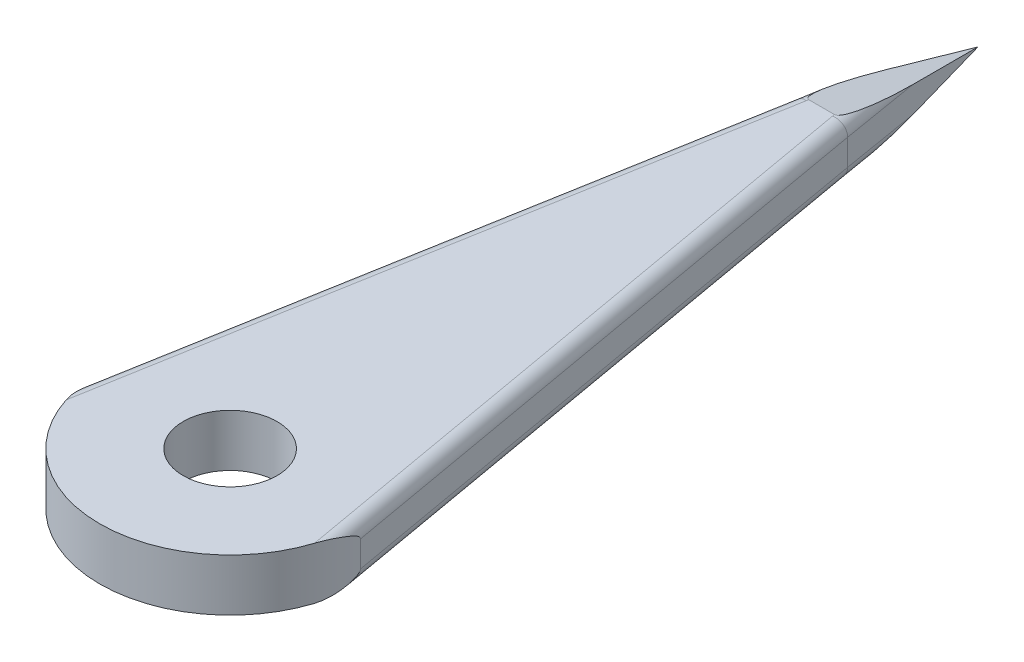
ISO-10303-21;
HEADER;
FILE_DESCRIPTION(('STEP AP214'),'2;1');
FILE_NAME('part.step','',(''),(''),'','','');
FILE_SCHEMA(('AUTOMOTIVE_DESIGN { 1 0 10303 214 1 1 1 1 }'));
ENDSEC;
DATA;
#1=APPLICATION_CONTEXT('core data for automotive mechanical design processes');
#2=APPLICATION_PROTOCOL_DEFINITION('international standard','automotive_design',2000,#1);
#3=PRODUCT_CONTEXT('',#1,'mechanical');
#4=PRODUCT('Part','Part','',(#3));
#5=PRODUCT_RELATED_PRODUCT_CATEGORY('part','',(#4));
#6=PRODUCT_DEFINITION_FORMATION('','',#4);
#7=PRODUCT_DEFINITION_CONTEXT('part definition',#1,'design');
#8=PRODUCT_DEFINITION('design','',#6,#7);
#9=PRODUCT_DEFINITION_SHAPE('','',#8);
#10=(LENGTH_UNIT() NAMED_UNIT(*) SI_UNIT(.MILLI.,.METRE.));
#11=(NAMED_UNIT(*) PLANE_ANGLE_UNIT() SI_UNIT($,.RADIAN.));
#12=(NAMED_UNIT(*) SI_UNIT($,.STERADIAN.) SOLID_ANGLE_UNIT());
#13=UNCERTAINTY_MEASURE_WITH_UNIT(LENGTH_MEASURE(1.E-05),#10,'distance_accuracy_value','');
#14=(GEOMETRIC_REPRESENTATION_CONTEXT(3) GLOBAL_UNCERTAINTY_ASSIGNED_CONTEXT((#13)) GLOBAL_UNIT_ASSIGNED_CONTEXT((#10,
#11,#12)) REPRESENTATION_CONTEXT('',''));
#15=CARTESIAN_POINT('',(0.,0.,0.));
#16=DIRECTION('',(0.,0.,1.));
#17=DIRECTION('',(1.,0.,0.));
#18=AXIS2_PLACEMENT_3D('',#15,#16,#17);
#19=CARTESIAN_POINT('',(0.,10.,0.));
#20=DIRECTION('',(0.,1.,0.));
#21=DIRECTION('',(0.,0.,1.));
#22=AXIS2_PLACEMENT_3D('',#19,#20,#21);
#23=PLANE('',#22);
#24=DIRECTION('',(-0.173648177666935,0.,-0.984807753012207));
#25=VECTOR('',#24,1.);
#26=CARTESIAN_POINT('',(2.53798061746943,10.,-112.991515948184));
#27=LINE('',#26,#25);
#28=CARTESIAN_POINT('',(23.8069497813539,10.,7.63080219296056));
#29=VERTEX_POINT('',#28);
#30=CARTESIAN_POINT('',(2.53798061746937,9.99999999757651,-112.991515948184));
#31=VERTEX_POINT('',#30);
#32=EDGE_CURVE('E460',#29,#31,#27,.T.);
#33=ORIENTED_EDGE('',*,*,#32,.T.);
#34=DIRECTION('',(-0.164398987305357,0.,-0.986393923832144));
#35=VECTOR('',#34,1.);
#36=CARTESIAN_POINT('',(2.5340151904196,10.,-113.014638924088));
#37=LINE('',#36,#35);
#38=CARTESIAN_POINT('',(2.46551561237576,10.,-113.425636392351));
#39=VERTEX_POINT('',#38);
#40=EDGE_CURVE('E302',#31,#39,#37,.T.);
#41=ORIENTED_EDGE('',*,*,#40,.T.);
#42=DIRECTION('',(1.,0.,0.));
#43=VECTOR('',#42,1.);
#44=CARTESIAN_POINT('',(0.,10.,-113.425636392351));
#45=LINE('',#44,#43);
#46=CARTESIAN_POINT('',(-2.46551561237576,10.,-113.425636392351));
#47=VERTEX_POINT('',#46);
#48=EDGE_CURVE('E202',#39,#47,#45,.F.);
#49=ORIENTED_EDGE('',*,*,#48,.T.);
#50=DIRECTION('',(-0.164398987305357,0.,0.986393923832144));
#51=VECTOR('',#50,1.);
#52=CARTESIAN_POINT('',(-21.4679021729631,10.,0.588682971172818));
#53=LINE('',#52,#51);
#54=CARTESIAN_POINT('',(-2.53798061746947,10.,-112.991515948184));
#55=VERTEX_POINT('',#54);
#56=EDGE_CURVE('E459',#47,#55,#53,.T.);
#57=ORIENTED_EDGE('',*,*,#56,.T.);
#58=DIRECTION('',(-0.173648177666935,0.,0.984807753012207));
#59=VECTOR('',#58,1.);
#60=CARTESIAN_POINT('',(-22.5379806174695,10.,0.434120444167337));
#61=LINE('',#60,#59);
#62=CARTESIAN_POINT('',(-23.8069497813539,10.,7.63080219296056));
#63=VERTEX_POINT('',#62);
#64=EDGE_CURVE('E456',#55,#63,#61,.T.);
#65=ORIENTED_EDGE('',*,*,#64,.T.);
#66=CARTESIAN_POINT('',(0.,10.,0.));
#67=DIRECTION('',(0.,1.,0.));
#68=DIRECTION('',(0.,0.,1.));
#69=AXIS2_PLACEMENT_3D('',#66,#67,#68);
#70=CIRCLE('',#69,25.);
#71=EDGE_CURVE('E198',#63,#29,#70,.T.);
#72=ORIENTED_EDGE('',*,*,#71,.T.);
#73=EDGE_LOOP('',(#33,#41,#49,#57,#65,#72));
#74=FACE_BOUND('',#73,.T.);
#75=CARTESIAN_POINT('',(0.,10.,0.));
#76=DIRECTION('',(0.,1.,0.));
#77=DIRECTION('',(0.,0.,1.));
#78=AXIS2_PLACEMENT_3D('',#75,#76,#77);
#79=CIRCLE('',#78,9.);
#80=CARTESIAN_POINT('',(0.,10.,9.));
#81=VERTEX_POINT('',#80);
#82=EDGE_CURVE('E190',#81,#81,#79,.T.);
#83=ORIENTED_EDGE('',*,*,#82,.F.);
#84=EDGE_LOOP('',(#83));
#85=FACE_BOUND('',#84,.T.);
#86=ADVANCED_FACE('F47',(#74,#85),#23,.T.);
#87=CARTESIAN_POINT('',(0.,0.,0.));
#88=DIRECTION('',(0.,1.,0.));
#89=DIRECTION('',(0.,0.,1.));
#90=AXIS2_PLACEMENT_3D('',#87,#88,#89);
#91=PLANE('',#90);
#92=DIRECTION('',(-0.173648177666935,0.,0.984807753012207));
#93=VECTOR('',#92,1.);
#94=CARTESIAN_POINT('',(-21.7841383772933,0.,-3.84113134740363));
#95=LINE('',#94,#93);
#96=CARTESIAN_POINT('',(-23.8069497813539,0.,7.63080219296055));
#97=VERTEX_POINT('',#96);
#98=CARTESIAN_POINT('',(-2.5378720358919,0.,-112.991497851254));
#99=VERTEX_POINT('',#98);
#100=EDGE_CURVE('E429',#97,#99,#95,.F.);
#101=ORIENTED_EDGE('',*,*,#100,.T.);
#102=DIRECTION('',(-0.164398987305357,0.,0.986393923832144));
#103=VECTOR('',#102,1.);
#104=CARTESIAN_POINT('',(-20.7922264972874,0.,-3.46537108288123));
#105=LINE('',#104,#103);
#106=CARTESIAN_POINT('',(-2.46551561237575,0.,-113.425636392351));
#107=VERTEX_POINT('',#106);
#108=EDGE_CURVE('E228',#99,#107,#105,.F.);
#109=ORIENTED_EDGE('',*,*,#108,.T.);
#110=DIRECTION('',(1.,0.,0.));
#111=VECTOR('',#110,1.);
#112=CARTESIAN_POINT('',(0.,0.,-113.425636392351));
#113=LINE('',#112,#111);
#114=CARTESIAN_POINT('',(2.46551561237575,0.,-113.425636392351));
#115=VERTEX_POINT('',#114);
#116=EDGE_CURVE('E203',#115,#107,#113,.F.);
#117=ORIENTED_EDGE('',*,*,#116,.F.);
#118=DIRECTION('',(-0.164398987305357,0.,-0.986393923832144));
#119=VECTOR('',#118,1.);
#120=CARTESIAN_POINT('',(20.7922264972874,0.,-3.46537108288123));
#121=LINE('',#120,#119);
#122=CARTESIAN_POINT('',(2.53798061746947,0.,-112.991515948184));
#123=VERTEX_POINT('',#122);
#124=EDGE_CURVE('E238',#115,#123,#121,.F.);
#125=ORIENTED_EDGE('',*,*,#124,.T.);
#126=DIRECTION('',(-0.173648177666935,0.,-0.984807753012207));
#127=VECTOR('',#126,1.);
#128=CARTESIAN_POINT('',(21.7841383772933,0.,-3.84113134740363));
#129=LINE('',#128,#127);
#130=CARTESIAN_POINT('',(23.8069497813539,0.,7.63080219296056));
#131=VERTEX_POINT('',#130);
#132=EDGE_CURVE('E434',#123,#131,#129,.F.);
#133=ORIENTED_EDGE('',*,*,#132,.T.);
#134=CARTESIAN_POINT('',(0.,0.,0.));
#135=DIRECTION('',(0.,1.,0.));
#136=DIRECTION('',(0.,0.,1.));
#137=AXIS2_PLACEMENT_3D('',#134,#135,#136);
#138=CIRCLE('',#137,25.);
#139=EDGE_CURVE('E194',#97,#131,#138,.T.);
#140=ORIENTED_EDGE('',*,*,#139,.F.);
#141=EDGE_LOOP('',(#101,#109,#117,#125,#133,#140));
#142=FACE_BOUND('',#141,.T.);
#143=CARTESIAN_POINT('',(0.,0.,0.));
#144=DIRECTION('',(0.,1.,0.));
#145=DIRECTION('',(0.,0.,1.));
#146=AXIS2_PLACEMENT_3D('',#143,#144,#145);
#147=CIRCLE('',#146,9.);
#148=CARTESIAN_POINT('',(0.,0.,9.));
#149=VERTEX_POINT('',#148);
#150=EDGE_CURVE('E172',#149,#149,#147,.T.);
#151=ORIENTED_EDGE('',*,*,#150,.T.);
#152=EDGE_LOOP('',(#151));
#153=FACE_BOUND('',#152,.T.);
#154=ADVANCED_FACE('F253',(#142,#153),#91,.F.);
#155=CARTESIAN_POINT('',(0.,10.,0.));
#156=DIRECTION('',(0.,-1.,0.));
#157=DIRECTION('',(0.,0.,-1.));
#158=AXIS2_PLACEMENT_3D('',#155,#156,#157);
#159=CYLINDRICAL_SURFACE('',#158,25.);
#160=ORIENTED_EDGE('',*,*,#139,.T.);
#161=CARTESIAN_POINT('',(23.8069497813539,0.,7.63080219296056));
#162=CARTESIAN_POINT('',(23.86118761935,2.90606387358615E-05,7.46160122354186));
#163=CARTESIAN_POINT('',(23.9136025654729,0.0041117199697887,7.29185614935265));
#164=CARTESIAN_POINT('',(24.0147033579821,0.0196050284943524,6.95165083974532));
#165=CARTESIAN_POINT('',(24.0633905021354,0.0310131143712274,6.78119087520216));
#166=CARTESIAN_POINT('',(24.1569518410746,0.060367077155256,6.43995069059922));
#167=CARTESIAN_POINT('',(24.2018291445944,0.0783075593155266,6.26917085015548));
#168=CARTESIAN_POINT('',(24.2877985871158,0.120139261944268,5.92738614118013));
#169=CARTESIAN_POINT('',(24.3288903655796,0.144031048420816,5.75638125278463));
#170=CARTESIAN_POINT('',(24.4461785016797,0.223663054999159,5.24465816415624));
#171=CARTESIAN_POINT('',(24.516763633619,0.287486534843838,4.90385691142774));
#172=CARTESIAN_POINT('',(24.6114707478153,0.397476751257461,4.39379808511729));
#173=CARTESIAN_POINT('',(24.641179524322,0.436518865190008,4.22395844264783));
#174=CARTESIAN_POINT('',(24.6969192939034,0.519236844944027,3.88480256049016));
#175=CARTESIAN_POINT('',(24.7229505629489,0.562912362630417,3.71548628246088));
#176=CARTESIAN_POINT('',(24.762469627763,0.637967936728816,3.43973029217252));
#177=CARTESIAN_POINT('',(24.7770498113683,0.667962957246176,3.33306610430292));
#178=CARTESIAN_POINT('',(24.8047655190724,0.729835530265041,3.12011826759896));
#179=CARTESIAN_POINT('',(24.8179012886104,0.761712761516158,3.01383455709133));
#180=CARTESIAN_POINT('',(24.8551674645724,0.860269387511625,2.69559760328611));
#181=CARTESIAN_POINT('',(24.8771541243613,0.929868760356525,2.48427682908946));
#182=CARTESIAN_POINT('',(24.9095952203396,1.05521637156981,2.12916120628585));
#183=CARTESIAN_POINT('',(24.9215143088576,1.10860635040243,1.98466248858424));
#184=CARTESIAN_POINT('',(24.9427151717141,1.22054191307143,1.69754043181202));
#185=CARTESIAN_POINT('',(24.9519983717919,1.27908468725089,1.55491611885505));
#186=CARTESIAN_POINT('',(24.9654921026479,1.3835576744935,1.31668496581051));
#187=CARTESIAN_POINT('',(24.9703809250095,1.4277006301266,1.22033373578047));
#188=CARTESIAN_POINT('',(24.9789727042369,1.52008414276259,1.02957115890348));
#189=CARTESIAN_POINT('',(24.9826760884007,1.56832321534607,0.935159124572295));
#190=CARTESIAN_POINT('',(24.9887220757472,1.66688710010627,0.755818543935629));
#191=CARTESIAN_POINT('',(24.9911412420334,1.71683522187439,0.670686402500149));
#192=CARTESIAN_POINT('',(24.9950353038236,1.82364100615413,0.504964396201369));
#193=CARTESIAN_POINT('',(24.9965129408549,1.88047802912087,0.424361972526507));
#194=CARTESIAN_POINT('',(24.9980541491194,1.97112356995395,0.31384138276737));
#195=CARTESIAN_POINT('',(24.998448994304,2.00050368409039,0.280333954251902));
#196=CARTESIAN_POINT('',(24.9990876474112,2.06234555800604,0.215982190889163));
#197=CARTESIAN_POINT('',(24.9993308739096,2.09481863683183,0.185148493382142));
#198=CARTESIAN_POINT('',(24.9996928290153,2.16414102393775,0.127307784202722));
#199=CARTESIAN_POINT('',(24.9998091524253,2.20106062350301,0.100382816880712));
#200=CARTESIAN_POINT('',(24.9999517891199,2.27922062926169,0.0542322606929398));
#201=CARTESIAN_POINT('',(24.9999790526366,2.32041055010239,0.0349273351654357));
#202=CARTESIAN_POINT('',(24.9999967926612,2.38536636768328,0.0145711327951832));
#203=CARTESIAN_POINT('',(24.9999987516389,2.40777393507592,0.00921086771850095));
#204=CARTESIAN_POINT('',(25.0000000165703,2.45342776594458,0.00187833751833617));
#205=CARTESIAN_POINT('',(24.9999992876308,2.47668115248554,-4.88825280096766E-05));
#206=CARTESIAN_POINT('',(25.,2.5,0.));
#207=B_SPLINE_CURVE_WITH_KNOTS('',3,(#161,#162,#163,#164,#165,#166,#167,#168,#169,#170,#171,
#172,#173,#174,#175,#176,#177,#178,#179,#180,#181,#182,#183,#184,#185,#186,#187,#188,#189,#190,
#191,#192,#193,#194,#195,#196,#197,#198,#199,#200,#201,#202,#203,#204,#205,#206),.UNSPECIFIED.,
.F.,.F.,(4,2,2,2,2,2,2,2,2,2,2,2,2,2,2,2,2,2,2,2,2,2,4),(0.,0.532932584561311,1.0656787866544,
1.59798601715028,2.13034389289775,3.19077816986885,3.72106136759603,4.25130475018522,
4.58655080693914,4.92173980932253,5.59217515879383,6.05561064000949,6.5187949716447,
6.83701008464178,7.15511036571006,7.45114885966266,7.74632136699551,7.87989251723258,
8.01397278207746,8.15055235076595,8.28566982871892,8.35454206169484,8.42431149227619),.UNSPECIFIED.);
#208=CARTESIAN_POINT('',(25.,2.5,0.));
#209=VERTEX_POINT('',#208);
#210=EDGE_CURVE('E270',#131,#209,#207,.T.);
#211=ORIENTED_EDGE('',*,*,#210,.T.);
#212=DIRECTION('',(0.,-1.,0.));
#213=VECTOR('',#212,1.);
#214=CARTESIAN_POINT('',(25.,10.,0.));
#215=LINE('',#214,#213);
#216=CARTESIAN_POINT('',(25.,7.5,0.));
#217=VERTEX_POINT('',#216);
#218=EDGE_CURVE('E212',#217,#209,#215,.T.);
#219=ORIENTED_EDGE('',*,*,#218,.F.);
#220=CARTESIAN_POINT('',(25.,7.5,0.));
#221=CARTESIAN_POINT('',(24.9999987771249,7.52765441440673,-9.06174578465152E-05));
#222=CARTESIAN_POINT('',(25.0000000890554,7.55517691592617,0.00263921472474038));
#223=CARTESIAN_POINT('',(24.9999975065192,7.60890684732646,0.0128554869018683));
#224=CARTESIAN_POINT('',(24.999993691592,7.63512797230361,0.02026833490609));
#225=CARTESIAN_POINT('',(24.9999673495212,7.69472233194478,0.0421885292219197));
#226=CARTESIAN_POINT('',(24.9999389213576,7.72750941197358,0.0582485042108595));
#227=CARTESIAN_POINT('',(24.9998253773941,7.79036365037819,0.0952770838970087));
#228=CARTESIAN_POINT('',(24.9997398630015,7.82040998347208,0.116279525982227));
#229=CARTESIAN_POINT('',(24.9994651054734,7.88319263623485,0.165711940906818));
#230=CARTESIAN_POINT('',(24.9992596396701,7.91540298015664,0.194797384160698));
#231=CARTESIAN_POINT('',(24.9987088012826,7.97691835730882,0.255926250753424));
#232=CARTESIAN_POINT('',(24.9983631766786,8.00621803809137,0.287974921714242));
#233=CARTESIAN_POINT('',(24.9975129071079,8.06259528964041,0.35418910652391));
#234=CARTESIAN_POINT('',(24.9970075727322,8.08966257292908,0.388363271783156));
#235=CARTESIAN_POINT('',(24.995827127886,8.14187379428088,0.458087318281707));
#236=CARTESIAN_POINT('',(24.9951521611652,8.167019337452,0.493636013244458));
#237=CARTESIAN_POINT('',(24.9929951815829,8.23581437523319,0.595396783729696));
#238=CARTESIAN_POINT('',(24.9913057700226,8.27768903497139,0.662800991571494));
#239=CARTESIAN_POINT('',(24.9872991590424,8.35777524712459,0.799747938706746));
#240=CARTESIAN_POINT('',(24.9849815430536,8.39598434602378,0.869292069782145));
#241=CARTESIAN_POINT('',(24.9770423734924,8.50659265142415,1.08034693051584));
#242=CARTESIAN_POINT('',(24.970439877006,8.57480282548953,1.22400970500256));
#243=CARTESIAN_POINT('',(24.9544932762578,8.7040524726802,1.51479482594488));
#244=CARTESIAN_POINT('',(24.9451410823744,8.76507003232784,1.66192618519219));
#245=CARTESIAN_POINT('',(24.9236477054168,8.88140761305994,1.95800542765486));
#246=CARTESIAN_POINT('',(24.9115099678982,8.93673455167757,2.1069508532147));
#247=CARTESIAN_POINT('',(24.8812151722611,9.05516211653285,2.44120911739481));
#248=CARTESIAN_POINT('',(24.8623142550535,9.11705485518528,2.62688096845023));
#249=CARTESIAN_POINT('',(24.8200956323687,9.23473052200828,2.99967639661601));
#250=CARTESIAN_POINT('',(24.7967772213248,9.29051247190793,3.18680020104872));
#251=CARTESIAN_POINT('',(24.7456285437092,9.39638562266383,3.56227611096448));
#252=CARTESIAN_POINT('',(24.7177930631217,9.44647013199219,3.75062939155554));
#253=CARTESIAN_POINT('',(24.6575675079573,9.54092756678546,4.12806139290637));
#254=CARTESIAN_POINT('',(24.6251769440923,9.58529987768766,4.31714018947293));
#255=CARTESIAN_POINT('',(24.5559567955646,9.66795307488565,4.6948565314692));
#256=CARTESIAN_POINT('',(24.5191488190311,9.70626164564803,4.88349196579041));
#257=CARTESIAN_POINT('',(24.4409368683711,9.77668342633792,5.26096511590824));
#258=CARTESIAN_POINT('',(24.3995330403575,9.80879683313542,5.44980282508514));
#259=CARTESIAN_POINT('',(24.3121553297389,9.86628419477466,5.82722764321483));
#260=CARTESIAN_POINT('',(24.266186559184,9.89166557407114,6.0158147980898));
#261=CARTESIAN_POINT('',(24.1696503293297,9.93505687199533,6.39263816395693));
#262=CARTESIAN_POINT('',(24.1190836696086,9.9530680693214,6.58087443018089));
#263=CARTESIAN_POINT('',(24.0256858345058,9.97763846444689,6.91294769194234));
#264=CARTESIAN_POINT('',(23.9837927516587,9.98588724724387,7.05692356216245));
#265=CARTESIAN_POINT('',(23.8973503161437,9.99706131704681,7.3443311935967));
#266=CARTESIAN_POINT('',(23.8528001070952,9.99998487807651,7.48776276336991));
#267=CARTESIAN_POINT('',(23.8069497813539,10.,7.63080219296056));
#268=B_SPLINE_CURVE_WITH_KNOTS('',3,(#220,#221,#222,#223,#224,#225,#226,#227,#228,#229,#230,
#231,#232,#233,#234,#235,#236,#237,#238,#239,#240,#241,#242,#243,#244,#245,#246,#247,#248,#249,
#250,#251,#252,#253,#254,#255,#256,#257,#258,#259,#260,#261,#262,#263,#264,#265,#266,#267),
.UNSPECIFIED.,.F.,.F.,(4,2,2,2,2,2,2,2,2,2,2,2,2,2,2,2,2,2,2,2,2,2,2,4),(0.,0.0826172610099825,
0.163967459057733,0.272875164935347,0.382551362593083,0.512456202847069,0.64259566836646,
0.773304753025832,0.903903443644084,1.14182360545087,1.37990192219809,1.85701376520105,
2.33554356373936,2.81348460895396,3.40319653140517,3.99300272279461,4.58349462955167,
5.17405001301736,5.76182614803339,6.34958360161588,6.93669012257959,7.52369473957773,
7.97410371590789,8.4246586499082),.UNSPECIFIED.);
#269=EDGE_CURVE('E229',#217,#29,#268,.T.);
#270=ORIENTED_EDGE('',*,*,#269,.T.);
#271=ORIENTED_EDGE('',*,*,#71,.F.);
#272=CARTESIAN_POINT('',(-23.8069497813539,10.,7.63080219296056));
#273=CARTESIAN_POINT('',(-23.86118761935,9.99997093936126,7.46160122354186));
#274=CARTESIAN_POINT('',(-23.9136025654729,9.99588828003021,7.29185614935265));
#275=CARTESIAN_POINT('',(-24.0147033579821,9.98039497150565,6.95165083974532));
#276=CARTESIAN_POINT('',(-24.0633905021354,9.96898688562877,6.78119087520216));
#277=CARTESIAN_POINT('',(-24.1569518410746,9.93963292284475,6.43995069059922));
#278=CARTESIAN_POINT('',(-24.2018291445944,9.92169244068447,6.26917085015548));
#279=CARTESIAN_POINT('',(-24.2877985871158,9.87986073805573,5.92738614118014));
#280=CARTESIAN_POINT('',(-24.3288903655796,9.85596895157918,5.75638125278464));
#281=CARTESIAN_POINT('',(-24.4461785016797,9.77633694500084,5.24465816415625));
#282=CARTESIAN_POINT('',(-24.516763633619,9.71251346515616,4.90385691142775));
#283=CARTESIAN_POINT('',(-24.6114707478153,9.60252324874254,4.3937980851173));
#284=CARTESIAN_POINT('',(-24.641179524322,9.56348113480999,4.22395844264783));
#285=CARTESIAN_POINT('',(-24.6969192939034,9.48076315505597,3.88480256049017));
#286=CARTESIAN_POINT('',(-24.7229505629489,9.43708763736959,3.71548628246088));
#287=CARTESIAN_POINT('',(-24.762469627763,9.36203206327119,3.43973029217253));
#288=CARTESIAN_POINT('',(-24.7770498113683,9.33203704275383,3.33306610430292));
#289=CARTESIAN_POINT('',(-24.8047655190724,9.27016446973496,3.12011826759896));
#290=CARTESIAN_POINT('',(-24.8179012886104,9.23828723848384,3.01383455709134));
#291=CARTESIAN_POINT('',(-24.8551674645724,9.13973061248838,2.69559760328611));
#292=CARTESIAN_POINT('',(-24.8771541243613,9.07013123964347,2.48427682908946));
#293=CARTESIAN_POINT('',(-24.9095952203396,8.94478362843019,2.12916120628585));
#294=CARTESIAN_POINT('',(-24.9215143088576,8.89139364959757,1.98466248858424));
#295=CARTESIAN_POINT('',(-24.9427151717141,8.77945808692857,1.69754043181201));
#296=CARTESIAN_POINT('',(-24.9519983717919,8.7209153127491,1.55491611885504));
#297=CARTESIAN_POINT('',(-24.9654921026479,8.6164423255065,1.31668496581049));
#298=CARTESIAN_POINT('',(-24.9703809250095,8.57229936987339,1.22033373578045));
#299=CARTESIAN_POINT('',(-24.9789727042369,8.4799158572374,1.02957115890346));
#300=CARTESIAN_POINT('',(-24.9826760884007,8.43167678465393,0.935159124572272));
#301=CARTESIAN_POINT('',(-24.9887220757472,8.33311289989373,0.755818543935604));
#302=CARTESIAN_POINT('',(-24.9911412420334,8.2831647781256,0.670686402500124));
#303=CARTESIAN_POINT('',(-24.9950353038236,8.17635899384586,0.504964396201343));
#304=CARTESIAN_POINT('',(-24.9965129408549,8.11952197087912,0.424361972526478));
#305=CARTESIAN_POINT('',(-24.9980541491194,8.02887643004603,0.313841382767342));
#306=CARTESIAN_POINT('',(-24.998448994304,7.99949631590959,0.280333954251876));
#307=CARTESIAN_POINT('',(-24.9990876474112,7.93765444199394,0.215982190889141));
#308=CARTESIAN_POINT('',(-24.9993308739096,7.90518136316815,0.185148493382121));
#309=CARTESIAN_POINT('',(-24.9996928290153,7.83585897606223,0.127307784202704));
#310=CARTESIAN_POINT('',(-24.9998091524253,7.79893937649697,0.100382816880697));
#311=CARTESIAN_POINT('',(-24.9999517891199,7.72077937073829,0.0542322606929274));
#312=CARTESIAN_POINT('',(-24.9999790526366,7.67958944989759,0.0349273351654223));
#313=CARTESIAN_POINT('',(-24.9999967926612,7.61463363231671,0.0145711327951736));
#314=CARTESIAN_POINT('',(-24.9999987516389,7.59222606492408,0.0092108677184937));
#315=CARTESIAN_POINT('',(-25.0000000165703,7.54657223405542,0.00187833751833142));
#316=CARTESIAN_POINT('',(-24.9999992876308,7.52331884751446,-4.88825280141811E-05));
#317=CARTESIAN_POINT('',(-25.,7.5,0.));
#318=B_SPLINE_CURVE_WITH_KNOTS('',3,(#272,#273,#274,#275,#276,#277,#278,#279,#280,#281,#282,
#283,#284,#285,#286,#287,#288,#289,#290,#291,#292,#293,#294,#295,#296,#297,#298,#299,#300,#301,
#302,#303,#304,#305,#306,#307,#308,#309,#310,#311,#312,#313,#314,#315,#316,#317),.UNSPECIFIED.,
.F.,.F.,(4,2,2,2,2,2,2,2,2,2,2,2,2,2,2,2,2,2,2,2,2,2,4),(0.,0.532932584561308,1.0656787866544,
1.59798601715028,2.13034389289775,3.19077816986884,3.72106136759602,4.25130475018521,
4.58655080693914,4.92173980932252,5.59217515879383,6.0556106400095,6.51879497164472,
6.8370100846418,7.15511036571008,7.45114885966269,7.74632136699555,7.87989251723262,
8.01397278207749,8.15055235076597,8.28566982871894,8.35454206169485,8.42431149227619),.UNSPECIFIED.);
#319=CARTESIAN_POINT('',(-25.,7.5,0.));
#320=VERTEX_POINT('',#319);
#321=EDGE_CURVE('E237',#63,#320,#318,.T.);
#322=ORIENTED_EDGE('',*,*,#321,.T.);
#323=DIRECTION('',(0.,-1.,0.));
#324=VECTOR('',#323,1.);
#325=CARTESIAN_POINT('',(-25.,10.,0.));
#326=LINE('',#325,#324);
#327=CARTESIAN_POINT('',(-25.,2.5,0.));
#328=VERTEX_POINT('',#327);
#329=EDGE_CURVE('E207',#320,#328,#326,.T.);
#330=ORIENTED_EDGE('',*,*,#329,.T.);
#331=CARTESIAN_POINT('',(-25.,2.5,0.));
#332=CARTESIAN_POINT('',(-24.9999987771248,2.47234558559326,-9.06174578688166E-05));
#333=CARTESIAN_POINT('',(-25.0000000890554,2.44482308407383,0.00263921472471636));
#334=CARTESIAN_POINT('',(-24.9999975065192,2.39109315267353,0.0128554869018551));
#335=CARTESIAN_POINT('',(-24.999993691592,2.36487202769639,0.0202683349060892));
#336=CARTESIAN_POINT('',(-24.9999673495212,2.30527766805522,0.0421885292219352));
#337=CARTESIAN_POINT('',(-24.9999389213576,2.27249058802641,0.0582485042108748));
#338=CARTESIAN_POINT('',(-24.9998253773941,2.2096363496218,0.0952770838970245));
#339=CARTESIAN_POINT('',(-24.9997398630015,2.17959001652791,0.116279525982243));
#340=CARTESIAN_POINT('',(-24.9994651054734,2.11680736376515,0.165711940906836));
#341=CARTESIAN_POINT('',(-24.9992596396701,2.08459701984336,0.194797384160718));
#342=CARTESIAN_POINT('',(-24.9987088012826,2.02308164269118,0.255926250753443));
#343=CARTESIAN_POINT('',(-24.9983631766786,1.99378196190863,0.287974921714259));
#344=CARTESIAN_POINT('',(-24.9975129071079,1.93740471035958,0.354189106523926));
#345=CARTESIAN_POINT('',(-24.9970075727322,1.91033742707092,0.388363271783174));
#346=CARTESIAN_POINT('',(-24.995827127886,1.85812620571912,0.458087318281727));
#347=CARTESIAN_POINT('',(-24.9951521611652,1.83298066254801,0.493636013244477));
#348=CARTESIAN_POINT('',(-24.9929951815829,1.76418562476681,0.595396783729712));
#349=CARTESIAN_POINT('',(-24.9913057700226,1.72231096502861,0.662800991571508));
#350=CARTESIAN_POINT('',(-24.9872991590424,1.64222475287541,0.799747938706756));
#351=CARTESIAN_POINT('',(-24.9849815430536,1.60401565397622,0.869292069782154));
#352=CARTESIAN_POINT('',(-24.9770423734924,1.49340734857585,1.08034693051585));
#353=CARTESIAN_POINT('',(-24.970439877006,1.42519717451048,1.22400970500256));
#354=CARTESIAN_POINT('',(-24.9544932762578,1.29594752731981,1.51479482594487));
#355=CARTESIAN_POINT('',(-24.9451410823744,1.23492996767217,1.66192618519218));
#356=CARTESIAN_POINT('',(-24.9236477054168,1.11859238694007,1.95800542765484));
#357=CARTESIAN_POINT('',(-24.9115099678982,1.06326544832244,2.10695085321468));
#358=CARTESIAN_POINT('',(-24.8812151722611,0.944837883467157,2.44120911739478));
#359=CARTESIAN_POINT('',(-24.8623142550535,0.882945144814738,2.6268809684502));
#360=CARTESIAN_POINT('',(-24.8200956323687,0.765269477991733,2.99967639661597));
#361=CARTESIAN_POINT('',(-24.7967772213248,0.709487528092086,3.18680020104868));
#362=CARTESIAN_POINT('',(-24.7456285437092,0.603614377336182,3.56227611096444));
#363=CARTESIAN_POINT('',(-24.7177930631217,0.553529868007822,3.75062939155549));
#364=CARTESIAN_POINT('',(-24.6575675079574,0.459072433214556,4.12806139290631));
#365=CARTESIAN_POINT('',(-24.6251769440923,0.414700122312352,4.31714018947287));
#366=CARTESIAN_POINT('',(-24.5559567955647,0.332046925114364,4.69485653146914));
#367=CARTESIAN_POINT('',(-24.5191488190311,0.293738354351986,4.88349196579034));
#368=CARTESIAN_POINT('',(-24.4409368683711,0.223316573662089,5.26096511590816));
#369=CARTESIAN_POINT('',(-24.3995330403575,0.191203166864591,5.44980282508506));
#370=CARTESIAN_POINT('',(-24.3121553297389,0.133715805225355,5.82722764321475));
#371=CARTESIAN_POINT('',(-24.266186559184,0.108334425928872,6.01581479808971));
#372=CARTESIAN_POINT('',(-24.1696503293297,0.0649431280046767,6.39263816395683));
#373=CARTESIAN_POINT('',(-24.1190836696086,0.0469319306786094,6.58087443018079));
#374=CARTESIAN_POINT('',(-24.0256858345058,0.0223615355531106,6.91294769194226));
#375=CARTESIAN_POINT('',(-23.9837927516587,0.0141127527561304,7.05692356216238));
#376=CARTESIAN_POINT('',(-23.8973503161437,0.00293868295319113,7.34433119359667));
#377=CARTESIAN_POINT('',(-23.8528001070952,1.51219234849637E-05,7.48776276336989));
#378=CARTESIAN_POINT('',(-23.8069497813539,0.,7.63080219296055));
#379=B_SPLINE_CURVE_WITH_KNOTS('',3,(#331,#332,#333,#334,#335,#336,#337,#338,#339,#340,#341,
#342,#343,#344,#345,#346,#347,#348,#349,#350,#351,#352,#353,#354,#355,#356,#357,#358,#359,#360,
#361,#362,#363,#364,#365,#366,#367,#368,#369,#370,#371,#372,#373,#374,#375,#376,#377,#378),
.UNSPECIFIED.,.F.,.F.,(4,2,2,2,2,2,2,2,2,2,2,2,2,2,2,2,2,2,2,2,2,2,2,4),(0.,0.0826172610099868,
0.163967459057742,0.27287516493536,0.382551362593098,0.512456202847085,0.642595668366473,
0.773304753025844,0.903903443644095,1.14182360545088,1.37990192219809,1.85701376520104,
2.33554356373934,2.81348460895393,3.40319653140513,3.99300272279455,4.58349462955161,
5.17405001301729,5.76182614803331,6.34958360161579,6.93669012257949,7.52369473957762,
7.97410371590783,8.4246586499082),.UNSPECIFIED.);
#380=EDGE_CURVE('E263',#328,#97,#379,.T.);
#381=ORIENTED_EDGE('',*,*,#380,.T.);
#382=EDGE_LOOP('',(#160,#211,#219,#270,#271,#322,#330,#381));
#383=FACE_BOUND('',#382,.T.);
#384=ADVANCED_FACE('F247',(#383),#159,.T.);
#385=CARTESIAN_POINT('',(25.,10.,0.));
#386=DIRECTION('',(-0.984807753012207,0.,0.173648177666935));
#387=DIRECTION('',(0.173648177666935,0.,0.984807753012207));
#388=AXIS2_PLACEMENT_3D('',#385,#386,#387);
#389=PLANE('',#388);
#390=ORIENTED_EDGE('',*,*,#218,.T.);
#391=DIRECTION('',(-0.173648177666935,0.,-0.984807753012207));
#392=VECTOR('',#391,1.);
#393=CARTESIAN_POINT('',(25.,2.5,0.));
#394=LINE('',#393,#392);
#395=CARTESIAN_POINT('',(5.,2.5,-113.425636392351));
#396=VERTEX_POINT('',#395);
#397=EDGE_CURVE('E398',#209,#396,#394,.T.);
#398=ORIENTED_EDGE('',*,*,#397,.T.);
#399=DIRECTION('',(0.,1.,0.));
#400=VECTOR('',#399,1.);
#401=CARTESIAN_POINT('',(5.,0.,-113.425636392351));
#402=LINE('',#401,#400);
#403=CARTESIAN_POINT('',(5.,7.5,-113.425636392351));
#404=VERTEX_POINT('',#403);
#405=EDGE_CURVE('E217',#404,#396,#402,.F.);
#406=ORIENTED_EDGE('',*,*,#405,.F.);
#407=DIRECTION('',(-0.173648177666935,0.,-0.984807753012207));
#408=VECTOR('',#407,1.);
#409=CARTESIAN_POINT('',(25.,7.5,0.));
#410=LINE('',#409,#408);
#411=EDGE_CURVE('E216',#404,#217,#410,.F.);
#412=ORIENTED_EDGE('',*,*,#411,.T.);
#413=EDGE_LOOP('',(#390,#398,#406,#412));
#414=FACE_BOUND('',#413,.T.);
#415=ADVANCED_FACE('F252',(#414),#389,.F.);
#416=CARTESIAN_POINT('',(-5.,10.,-113.425636392351));
#417=DIRECTION('',(0.984807753012207,0.,0.173648177666935));
#418=DIRECTION('',(0.173648177666935,0.,-0.984807753012207));
#419=AXIS2_PLACEMENT_3D('',#416,#417,#418);
#420=PLANE('',#419);
#421=DIRECTION('',(0.,1.,0.));
#422=VECTOR('',#421,1.);
#423=CARTESIAN_POINT('',(-5.,10.,-113.425636392351));
#424=LINE('',#423,#422);
#425=CARTESIAN_POINT('',(-5.,7.5,-113.425636392351));
#426=VERTEX_POINT('',#425);
#427=CARTESIAN_POINT('',(-5.,2.5,-113.425636392351));
#428=VERTEX_POINT('',#427);
#429=EDGE_CURVE('E211',#426,#428,#424,.F.);
#430=ORIENTED_EDGE('',*,*,#429,.T.);
#431=DIRECTION('',(-0.173648177666935,0.,0.984807753012207));
#432=VECTOR('',#431,1.);
#433=CARTESIAN_POINT('',(-5.,2.5,-113.425636392351));
#434=LINE('',#433,#432);
#435=EDGE_CURVE('E294',#428,#328,#434,.T.);
#436=ORIENTED_EDGE('',*,*,#435,.T.);
#437=ORIENTED_EDGE('',*,*,#329,.F.);
#438=DIRECTION('',(-0.173648177666935,0.,0.984807753012207));
#439=VECTOR('',#438,1.);
#440=CARTESIAN_POINT('',(-5.,7.5,-113.425636392351));
#441=LINE('',#440,#439);
#442=EDGE_CURVE('E303',#320,#426,#441,.F.);
#443=ORIENTED_EDGE('',*,*,#442,.T.);
#444=EDGE_LOOP('',(#430,#436,#437,#443));
#445=FACE_BOUND('',#444,.T.);
#446=ADVANCED_FACE('F359',(#445),#420,.F.);
#447=CARTESIAN_POINT('',(0.,10.,0.));
#448=DIRECTION('',(0.,-1.,0.));
#449=DIRECTION('',(0.,0.,-1.));
#450=AXIS2_PLACEMENT_3D('',#447,#448,#449);
#451=CYLINDRICAL_SURFACE('',#450,9.);
#452=ORIENTED_EDGE('',*,*,#82,.T.);
#453=EDGE_LOOP('',(#452));
#454=FACE_BOUND('',#453,.T.);
#455=ORIENTED_EDGE('',*,*,#150,.F.);
#456=EDGE_LOOP('',(#455));
#457=FACE_BOUND('',#456,.T.);
#458=ADVANCED_FACE('F357',(#454,#457),#451,.F.);
#459=CARTESIAN_POINT('',(0.,28.1230761717326,-4.68717936195544));
#460=DIRECTION('',(0.,-0.986393923832144,0.164398987305357));
#461=DIRECTION('',(0.,-0.164398987305357,-0.986393923832144));
#462=AXIS2_PLACEMENT_3D('',#459,#460,#461);
#463=PLANE('',#462);
#464=DIRECTION('',(0.162221421130762,-0.162221421130762,-0.973328526784575));
#465=VECTOR('',#464,1.);
#466=CARTESIAN_POINT('',(-5.,10.,-113.425636392351));
#467=LINE('',#466,#465);
#468=CARTESIAN_POINT('',(-2.5,7.5,-128.425636392351));
#469=VERTEX_POINT('',#468);
#470=CARTESIAN_POINT('',(0.,5.,-143.425636392351));
#471=VERTEX_POINT('',#470);
#472=EDGE_CURVE('E148',#469,#471,#467,.T.);
#473=ORIENTED_EDGE('',*,*,#472,.F.);
#474=CARTESIAN_POINT('',(0.0344843876242569,7.5,-128.425636392351));
#475=DIRECTION('',(0.,-0.986393923832144,0.164398987305357));
#476=DIRECTION('',(0.166604139308748,-0.162101324732836,-0.972607948397015));
#477=AXIS2_PLACEMENT_3D('',#474,#475,#476);
#478=ELLIPSE('',#477,15.4166666666667,2.5);
#479=EDGE_CURVE('E12',#469,#47,#478,.F.);
#480=ORIENTED_EDGE('',*,*,#479,.T.);
#481=ORIENTED_EDGE('',*,*,#48,.F.);
#482=CARTESIAN_POINT('',(-0.0344843876242569,7.5,-128.425636392351));
#483=DIRECTION('',(0.,-0.986393923832144,0.164398987305357));
#484=DIRECTION('',(0.166604139308748,0.162101324732836,0.972607948397015));
#485=AXIS2_PLACEMENT_3D('',#482,#483,#484);
#486=ELLIPSE('',#485,15.4166666666667,2.5);
#487=CARTESIAN_POINT('',(2.5,7.5,-128.425636392351));
#488=VERTEX_POINT('',#487);
#489=EDGE_CURVE('E58',#39,#488,#486,.F.);
#490=ORIENTED_EDGE('',*,*,#489,.T.);
#491=DIRECTION('',(-0.162221421130762,-0.162221421130762,-0.973328526784575));
#492=VECTOR('',#491,1.);
#493=CARTESIAN_POINT('',(5.,10.,-113.425636392351));
#494=LINE('',#493,#492);
#495=EDGE_CURVE('E161',#488,#471,#494,.T.);
#496=ORIENTED_EDGE('',*,*,#495,.T.);
#497=EDGE_LOOP('',(#473,#480,#481,#490,#496));
#498=FACE_BOUND('',#497,.T.);
#499=ADVANCED_FACE('F175',(#498),#463,.F.);
#500=CARTESIAN_POINT('',(-23.2582113068678,0.,-3.87636855114463));
#501=DIRECTION('',(0.986393923832144,0.,0.164398987305357));
#502=DIRECTION('',(0.164398987305357,0.,-0.986393923832144));
#503=AXIS2_PLACEMENT_3D('',#500,#501,#502);
#504=PLANE('',#503);
#505=DIRECTION('',(0.162221421130762,0.162221421130762,-0.973328526784575));
#506=VECTOR('',#505,1.);
#507=CARTESIAN_POINT('',(-5.,0.,-113.425636392351));
#508=LINE('',#507,#506);
#509=CARTESIAN_POINT('',(-2.5,2.5,-128.425636392351));
#510=VERTEX_POINT('',#509);
#511=EDGE_CURVE('E152',#510,#471,#508,.T.);
#512=ORIENTED_EDGE('',*,*,#511,.F.);
#513=DIRECTION('',(-0.164398987305357,0.,0.986393923832144));
#514=VECTOR('',#513,1.);
#515=CARTESIAN_POINT('',(-23.2582113068678,2.5,-3.87636855114463));
#516=LINE('',#515,#514);
#517=EDGE_CURVE('E306',#510,#428,#516,.T.);
#518=ORIENTED_EDGE('',*,*,#517,.T.);
#519=ORIENTED_EDGE('',*,*,#429,.F.);
#520=DIRECTION('',(-0.164398987305357,0.,0.986393923832144));
#521=VECTOR('',#520,1.);
#522=CARTESIAN_POINT('',(-5.,7.5,-113.425636392351));
#523=LINE('',#522,#521);
#524=EDGE_CURVE('E155',#426,#469,#523,.F.);
#525=ORIENTED_EDGE('',*,*,#524,.T.);
#526=ORIENTED_EDGE('',*,*,#472,.T.);
#527=EDGE_LOOP('',(#512,#518,#519,#525,#526));
#528=FACE_BOUND('',#527,.T.);
#529=ADVANCED_FACE('F150',(#528),#504,.F.);
#530=CARTESIAN_POINT('',(23.2582113068678,0.,-3.87636855114463));
#531=DIRECTION('',(-0.986393923832144,0.,0.164398987305357));
#532=DIRECTION('',(0.164398987305357,0.,0.986393923832144));
#533=AXIS2_PLACEMENT_3D('',#530,#531,#532);
#534=PLANE('',#533);
#535=ORIENTED_EDGE('',*,*,#405,.T.);
#536=DIRECTION('',(-0.164398987305357,0.,-0.986393923832144));
#537=VECTOR('',#536,1.);
#538=CARTESIAN_POINT('',(23.2582113068678,2.5,-3.87636855114463));
#539=LINE('',#538,#537);
#540=CARTESIAN_POINT('',(2.5,2.5,-128.425636392351));
#541=VERTEX_POINT('',#540);
#542=EDGE_CURVE('E186',#396,#541,#539,.T.);
#543=ORIENTED_EDGE('',*,*,#542,.T.);
#544=DIRECTION('',(-0.162221421130762,0.162221421130762,-0.973328526784575));
#545=VECTOR('',#544,1.);
#546=CARTESIAN_POINT('',(5.,0.,-113.425636392351));
#547=LINE('',#546,#545);
#548=EDGE_CURVE('E160',#541,#471,#547,.T.);
#549=ORIENTED_EDGE('',*,*,#548,.T.);
#550=ORIENTED_EDGE('',*,*,#495,.F.);
#551=DIRECTION('',(-0.164398987305357,0.,-0.986393923832144));
#552=VECTOR('',#551,1.);
#553=CARTESIAN_POINT('',(23.9338869825435,7.5,0.177685502909426));
#554=LINE('',#553,#552);
#555=EDGE_CURVE('E390',#488,#404,#554,.F.);
#556=ORIENTED_EDGE('',*,*,#555,.T.);
#557=EDGE_LOOP('',(#535,#543,#549,#550,#556));
#558=FACE_BOUND('',#557,.T.);
#559=ADVANCED_FACE('F184',(#558),#534,.F.);
#560=CARTESIAN_POINT('',(0.,-18.3933464420029,-3.06555774033382));
#561=DIRECTION('',(0.,0.986393923832144,0.164398987305357));
#562=DIRECTION('',(0.,-0.164398987305357,0.986393923832144));
#563=AXIS2_PLACEMENT_3D('',#560,#561,#562);
#564=PLANE('',#563);
#565=ORIENTED_EDGE('',*,*,#548,.F.);
#566=CARTESIAN_POINT('',(-0.0344843876242534,2.5,-128.425636392351));
#567=DIRECTION('',(0.,0.986393923832144,0.164398987305357));
#568=DIRECTION('',(-0.166604139308748,0.162101324732836,-0.972607948397015));
#569=AXIS2_PLACEMENT_3D('',#566,#567,#568);
#570=ELLIPSE('',#569,15.4166666666667,2.5);
#571=EDGE_CURVE('E225',#541,#115,#570,.F.);
#572=ORIENTED_EDGE('',*,*,#571,.T.);
#573=ORIENTED_EDGE('',*,*,#116,.T.);
#574=CARTESIAN_POINT('',(0.0344843876242534,2.5,-128.425636392351));
#575=DIRECTION('',(0.,0.986393923832144,0.164398987305357));
#576=DIRECTION('',(-0.166604139308748,-0.162101324732836,0.972607948397015));
#577=AXIS2_PLACEMENT_3D('',#574,#575,#576);
#578=ELLIPSE('',#577,15.4166666666667,2.5);
#579=EDGE_CURVE('E170',#107,#510,#578,.F.);
#580=ORIENTED_EDGE('',*,*,#579,.T.);
#581=ORIENTED_EDGE('',*,*,#511,.T.);
#582=EDGE_LOOP('',(#565,#572,#573,#580,#581));
#583=FACE_BOUND('',#582,.T.);
#584=ADVANCED_FACE('F165',(#583),#564,.F.);
#585=CARTESIAN_POINT('',(20.7922264972874,2.5,-3.46537108288123));
#586=DIRECTION('',(-0.164398987305357,0.,-0.986393923832144));
#587=DIRECTION('',(-0.986393923832144,0.,0.164398987305357));
#588=AXIS2_PLACEMENT_3D('',#585,#586,#587);
#589=CYLINDRICAL_SURFACE('',#588,2.5);
#590=ORIENTED_EDGE('',*,*,#571,.F.);
#591=ORIENTED_EDGE('',*,*,#542,.F.);
#592=CARTESIAN_POINT('',(2.53798061746947,2.5,-112.991515948184));
#593=DIRECTION('',(0.173648177666935,0.,0.984807753012207));
#594=DIRECTION('',(0.,-1.,0.));
#595=AXIS2_PLACEMENT_3D('',#592,#593,#594);
#596=CIRCLE('',#595,2.5);
#597=EDGE_CURVE('E181',#123,#396,#596,.T.);
#598=ORIENTED_EDGE('',*,*,#597,.F.);
#599=ORIENTED_EDGE('',*,*,#124,.F.);
#600=EDGE_LOOP('',(#590,#591,#598,#599));
#601=FACE_BOUND('',#600,.T.);
#602=ADVANCED_FACE('F489',(#601),#589,.T.);
#603=CARTESIAN_POINT('',(22.5379806174695,2.5,0.434120444167337));
#604=DIRECTION('',(-0.173648177666935,0.,-0.984807753012207));
#605=DIRECTION('',(-0.984807753012207,0.,0.173648177666935));
#606=AXIS2_PLACEMENT_3D('',#603,#604,#605);
#607=CYLINDRICAL_SURFACE('',#606,2.5);
#608=ORIENTED_EDGE('',*,*,#210,.F.);
#609=ORIENTED_EDGE('',*,*,#132,.F.);
#610=ORIENTED_EDGE('',*,*,#597,.T.);
#611=ORIENTED_EDGE('',*,*,#397,.F.);
#612=EDGE_LOOP('',(#608,#609,#610,#611));
#613=FACE_BOUND('',#612,.T.);
#614=ADVANCED_FACE('F256',(#613),#607,.T.);
#615=CARTESIAN_POINT('',(-2.53798061746948,2.5,-112.991515948184));
#616=DIRECTION('',(-0.173648177666935,0.,0.984807753012207));
#617=DIRECTION('',(0.984807753012207,0.,0.173648177666935));
#618=AXIS2_PLACEMENT_3D('',#615,#616,#617);
#619=CYLINDRICAL_SURFACE('',#618,2.5);
#620=ORIENTED_EDGE('',*,*,#380,.F.);
#621=ORIENTED_EDGE('',*,*,#435,.F.);
#622=CARTESIAN_POINT('',(-2.53798061746937,2.42349109530471E-09,-112.991515948184));
#623=CARTESIAN_POINT('',(-2.56354066894401,1.00673682692139E-06,-112.996022874571));
#624=CARTESIAN_POINT('',(-2.58910086848642,0.000406425337094074,-113.00052872868));
#625=CARTESIAN_POINT('',(-2.64002487250399,0.00201964151101612,-113.009503818141));
#626=CARTESIAN_POINT('',(-2.6653888412113,0.00322202174540399,-113.013973095884));
#627=CARTESIAN_POINT('',(-2.71589666869376,0.00641194707208443,-113.022871080401));
#628=CARTESIAN_POINT('',(-2.7410408545774,0.00839411803839637,-113.027299856914));
#629=CARTESIAN_POINT('',(-2.79108633928259,0.0131255927271802,-113.03611304177));
#630=CARTESIAN_POINT('',(-2.81598812502602,0.0158695720004817,-113.040497546702));
#631=CARTESIAN_POINT('',(-2.86552742140866,0.022106248544956,-113.049218626243));
#632=CARTESIAN_POINT('',(-2.89016557253646,0.0255936746952863,-113.05355532323));
#633=CARTESIAN_POINT('',(-2.93915588150965,0.0332979764686438,-113.062177156945));
#634=CARTESIAN_POINT('',(-2.96350883887899,0.0375096413093304,-113.066462442844));
#635=CARTESIAN_POINT('',(-3.03585620404468,0.0511623564130423,-113.079191526421));
#636=CARTESIAN_POINT('',(-3.08365732467798,0.0616866697240098,-113.08759977211));
#637=CARTESIAN_POINT('',(-3.17788715685602,0.085436733323099,-113.104171882458));
#638=CARTESIAN_POINT('',(-3.22432571525078,0.0986223911456007,-113.112337521019));
#639=CARTESIAN_POINT('',(-3.31570491976278,0.127530602579702,-113.128403535849));
#640=CARTESIAN_POINT('',(-3.36065748481861,0.143214267143535,-113.136306034646));
#641=CARTESIAN_POINT('',(-3.44894963879248,0.176949737003074,-113.151826578313));
#642=CARTESIAN_POINT('',(-3.49230315763739,0.194963969978907,-113.159447085022));
#643=CARTESIAN_POINT('',(-3.57729904220282,0.23318995541015,-113.174387280328));
#644=CARTESIAN_POINT('',(-3.61895718942654,0.253365537755612,-113.181709743499));
#645=CARTESIAN_POINT('',(-3.7004787642281,0.29574267523205,-113.196039918988));
#646=CARTESIAN_POINT('',(-3.74035968990007,0.31790953901784,-113.203050696358));
#647=CARTESIAN_POINT('',(-3.8182577874977,0.364097959963687,-113.216745990282));
#648=CARTESIAN_POINT('',(-3.85629403212628,0.388086367681191,-113.22343383889));
#649=CARTESIAN_POINT('',(-3.93044753539794,0.437747872678842,-113.236474065196));
#650=CARTESIAN_POINT('',(-3.96658530186422,0.463389413942372,-113.242830018918));
#651=CARTESIAN_POINT('',(-4.03689979584839,0.516189396044549,-113.255199441745));
#652=CARTESIAN_POINT('',(-4.07109832782458,0.543317914388326,-113.261216707989));
#653=CARTESIAN_POINT('',(-4.13750477752934,0.598927113644615,-113.272903821513));
#654=CARTESIAN_POINT('',(-4.16973566020249,0.627379534916668,-113.278577664599));
#655=CARTESIAN_POINT('',(-4.23218899358732,0.685475605632094,-113.289574956811));
#656=CARTESIAN_POINT('',(-4.26243543640351,0.715092677433915,-113.294902578449));
#657=CARTESIAN_POINT('',(-4.32091308631122,0.775361577805234,-113.305206288157));
#658=CARTESIAN_POINT('',(-4.34916918278048,0.805988520315261,-113.310186704071));
#659=CARTESIAN_POINT('',(-4.40366959427965,0.868125728266174,-113.319796572121));
#660=CARTESIAN_POINT('',(-4.42993957000453,0.899612799883923,-113.324430486732));
#661=CARTESIAN_POINT('',(-4.48048069035413,0.963324361760215,-113.333349504332));
#662=CARTESIAN_POINT('',(-4.50477814540208,0.995527342799503,-113.337639184479));
#663=CARTESIAN_POINT('',(-4.55139590939049,1.06053076194234,-113.345873340763));
#664=CARTESIAN_POINT('',(-4.57374306162665,1.0933113601549,-113.349822489598));
#665=CARTESIAN_POINT('',(-4.61648988456514,1.15933633317515,-113.35738052045));
#666=CARTESIAN_POINT('',(-4.63691681961727,1.19256251514178,-113.360994152431));
#667=CARTESIAN_POINT('',(-4.67586010877725,1.25935152421687,-113.367887292396));
#668=CARTESIAN_POINT('',(-4.69440404175252,1.29289777688573,-113.37117161024));
#669=CARTESIAN_POINT('',(-4.72962473584909,1.36020654680448,-113.377413349105));
#670=CARTESIAN_POINT('',(-4.74632928928936,1.39395407361829,-113.380375623451));
#671=CARTESIAN_POINT('',(-4.77792043440003,1.4615519025668,-113.385981468896));
#672=CARTESIAN_POINT('',(-4.79283493638145,1.49538875872677,-113.388629921322));
#673=CARTESIAN_POINT('',(-4.82090030553371,1.56305873196596,-113.393617168851));
#674=CARTESIAN_POINT('',(-4.83407911124259,1.59687990343198,-113.395960858803));
#675=CARTESIAN_POINT('',(-4.85873187383412,1.66441899907025,-113.400348369984));
#676=CARTESIAN_POINT('',(-4.87023371345396,1.69812642989885,-113.402397086093));
#677=CARTESIAN_POINT('',(-4.8915951595369,1.76534552592982,-113.406205075936));
#678=CARTESIAN_POINT('',(-4.90148251464938,1.79884809851611,-113.407969232094));
#679=CARTESIAN_POINT('',(-4.91968083849044,1.86557189016101,-113.411219066303));
#680=CARTESIAN_POINT('',(-4.92801934919377,1.89878536285634,-113.412709602829));
#681=CARTESIAN_POINT('',(-4.94318849434231,1.9648521991095,-113.41542360536));
#682=CARTESIAN_POINT('',(-4.95004639715378,1.99769910563917,-113.416651895388));
#683=CARTESIAN_POINT('',(-4.9623249690287,2.06296075349791,-113.418853167034));
#684=CARTESIAN_POINT('',(-4.967772571392,2.09537026823932,-113.419830928695));
#685=CARTESIAN_POINT('',(-4.97730280592458,2.15969161341405,-113.421543175843));
#686=CARTESIAN_POINT('',(-4.98141198051026,2.19159938725299,-113.422282388848));
#687=CARTESIAN_POINT('',(-4.98833881709819,2.25485807759349,-113.423529766627));
#688=CARTESIAN_POINT('',(-4.9911825792385,2.28620604593994,-113.42404259872));
#689=CARTESIAN_POINT('',(-4.99565266725403,2.34829209146033,-113.424849553891));
#690=CARTESIAN_POINT('',(-4.99730460779913,2.37902826649019,-113.425148277609));
#691=CARTESIAN_POINT('',(-4.99946586408965,2.43984358050191,-113.425539444221));
#692=CARTESIAN_POINT('',(-5.00000025928399,2.46992180093311,-113.425636414514));
#693=CARTESIAN_POINT('',(-5.,2.5,-113.425636392351));
#694=B_SPLINE_CURVE_WITH_KNOTS('',3,(#622,#623,#624,#625,#626,#627,#628,#629,#630,#631,#632,
#633,#634,#635,#636,#637,#638,#639,#640,#641,#642,#643,#644,#645,#646,#647,#648,#649,#650,#651,
#652,#653,#654,#655,#656,#657,#658,#659,#660,#661,#662,#663,#664,#665,#666,#667,#668,#669,#670,
#671,#672,#673,#674,#675,#676,#677,#678,#679,#680,#681,#682,#683,#684,#685,#686,#687,#688,#689,
#690,#691,#692,#693),.UNSPECIFIED.,.F.,.F.,(4,2,2,2,2,2,2,2,2,2,2,2,2,2,2,2,2,2,2,2,2,2,2,2,2,2,
2,2,2,2,2,2,2,2,2,4),(0.,0.0778598730674156,0.155195848828395,0.232007926998252,
0.308296107309636,0.384060389512928,0.459300773376514,0.608193337437836,0.7549909929219,
0.899693719326956,1.04230149675177,1.18281430590949,1.32123212814254,1.45755494543878,
1.59178274044878,1.72391549650456,1.8539531976398,1.9818958286117,2.10774337492469,
2.23149582285613,2.3531531594842,2.47271537271828,2.59018245133199,2.70555438499929,
2.81883116433384,2.93001278093213,3.03909922742075,3.14609049750822,3.2509865860421,
3.35378748907184,3.4544932039182,3.55310372925,3.64961906516932,3.74403921330596,
3.83636417692283,3.92659396103338),.UNSPECIFIED.);
#695=EDGE_CURVE('E418',#99,#428,#694,.T.);
#696=ORIENTED_EDGE('',*,*,#695,.F.);
#697=ORIENTED_EDGE('',*,*,#100,.F.);
#698=EDGE_LOOP('',(#620,#621,#696,#697));
#699=FACE_BOUND('',#698,.T.);
#700=ADVANCED_FACE('F276',(#699),#619,.T.);
#701=CARTESIAN_POINT('',(-20.7922264972874,2.5,-3.46537108288123));
#702=DIRECTION('',(-0.164398987305357,0.,0.986393923832144));
#703=DIRECTION('',(0.986393923832144,0.,0.164398987305357));
#704=AXIS2_PLACEMENT_3D('',#701,#702,#703);
#705=CYLINDRICAL_SURFACE('',#704,2.5);
#706=ORIENTED_EDGE('',*,*,#579,.F.);
#707=ORIENTED_EDGE('',*,*,#108,.F.);
#708=ORIENTED_EDGE('',*,*,#695,.T.);
#709=ORIENTED_EDGE('',*,*,#517,.F.);
#710=EDGE_LOOP('',(#706,#707,#708,#709));
#711=FACE_BOUND('',#710,.T.);
#712=ADVANCED_FACE('F281',(#711),#705,.T.);
#713=CARTESIAN_POINT('',(-21.7841383772933,7.5,-3.84113134740363));
#714=DIRECTION('',(0.173648177666935,0.,-0.984807753012207));
#715=DIRECTION('',(-0.984807753012207,0.,-0.173648177666935));
#716=AXIS2_PLACEMENT_3D('',#713,#714,#715);
#717=CYLINDRICAL_SURFACE('',#716,2.5);
#718=ORIENTED_EDGE('',*,*,#321,.F.);
#719=ORIENTED_EDGE('',*,*,#64,.F.);
#720=CARTESIAN_POINT('',(-5.00000000000001,7.5,-113.425636392351));
#721=CARTESIAN_POINT('',(-5.000000259284,7.53007819906692,-113.425636414514));
#722=CARTESIAN_POINT('',(-4.99946586408966,7.56015641949815,-113.425539444221));
#723=CARTESIAN_POINT('',(-4.99730460779913,7.62097173350993,-113.425148277609));
#724=CARTESIAN_POINT('',(-4.99565266725402,7.65170790853981,-113.424849553891));
#725=CARTESIAN_POINT('',(-4.99118257923849,7.71379395406025,-113.42404259872));
#726=CARTESIAN_POINT('',(-4.98833881709817,7.74514192240672,-113.423529766627));
#727=CARTESIAN_POINT('',(-4.98141198051023,7.80840061274727,-113.422282388848));
#728=CARTESIAN_POINT('',(-4.97730280592454,7.84030838658624,-113.421543175843));
#729=CARTESIAN_POINT('',(-4.96777257139195,7.904629731761,-113.419830928695));
#730=CARTESIAN_POINT('',(-4.96232496902864,7.93703924650243,-113.418853167034));
#731=CARTESIAN_POINT('',(-4.9500463971537,8.00230089436121,-113.416651895388));
#732=CARTESIAN_POINT('',(-4.94318849434223,8.0351478008909,-113.41542360536));
#733=CARTESIAN_POINT('',(-4.92801934919366,8.10121463714409,-113.412709602829));
#734=CARTESIAN_POINT('',(-4.91968083849032,8.13442810983944,-113.411219066303));
#735=CARTESIAN_POINT('',(-4.90148251464925,8.20115190148436,-113.407969232094));
#736=CARTESIAN_POINT('',(-4.89159515953676,8.23465447407066,-113.406205075936));
#737=CARTESIAN_POINT('',(-4.87023371345379,8.30187357010166,-113.402397086093));
#738=CARTESIAN_POINT('',(-4.85873187383394,8.33558100093027,-113.400348369984));
#739=CARTESIAN_POINT('',(-4.83407911124239,8.40312009656856,-113.395960858803));
#740=CARTESIAN_POINT('',(-4.82090030553349,8.43694126803459,-113.393617168851));
#741=CARTESIAN_POINT('',(-4.79283493638121,8.50461124127379,-113.388629921322));
#742=CARTESIAN_POINT('',(-4.77792043439978,8.53844809743376,-113.385981468896));
#743=CARTESIAN_POINT('',(-4.74632928928909,8.60604592638228,-113.380375623451));
#744=CARTESIAN_POINT('',(-4.7296247358488,8.6397934531961,-113.377413349105));
#745=CARTESIAN_POINT('',(-4.69440404175221,8.70710222311485,-113.37117161024));
#746=CARTESIAN_POINT('',(-4.67586010877692,8.74064847578371,-113.367887292396));
#747=CARTESIAN_POINT('',(-4.63691681961692,8.80743748485881,-113.360994152431));
#748=CARTESIAN_POINT('',(-4.61648988456478,8.84066366682543,-113.35738052045));
#749=CARTESIAN_POINT('',(-4.57374306162626,8.90668863984567,-113.349822489598));
#750=CARTESIAN_POINT('',(-4.5513959093901,8.93946923805823,-113.345873340763));
#751=CARTESIAN_POINT('',(-4.50477814540166,9.00447265720106,-113.337639184479));
#752=CARTESIAN_POINT('',(-4.4804806903537,9.03667563824034,-113.333349504332));
#753=CARTESIAN_POINT('',(-4.42993957000409,9.10038720011662,-113.324430486731));
#754=CARTESIAN_POINT('',(-4.4036695942792,9.13187427173436,-113.319796572121));
#755=CARTESIAN_POINT('',(-4.34916918278002,9.19401147968525,-113.310186704071));
#756=CARTESIAN_POINT('',(-4.32091308631075,9.22463842219527,-113.305206288157));
#757=CARTESIAN_POINT('',(-4.26243543640303,9.28490732256657,-113.294902578449));
#758=CARTESIAN_POINT('',(-4.23218899358684,9.31452439436838,-113.289574956811));
#759=CARTESIAN_POINT('',(-4.16973566020199,9.37262046508378,-113.278577664599));
#760=CARTESIAN_POINT('',(-4.13750477752885,9.40107288635582,-113.272903821513));
#761=CARTESIAN_POINT('',(-4.07109832782409,9.45668208561208,-113.261216707989));
#762=CARTESIAN_POINT('',(-4.03689979584788,9.48381060395584,-113.255199441744));
#763=CARTESIAN_POINT('',(-3.96658530186371,9.53661058605799,-113.242830018918));
#764=CARTESIAN_POINT('',(-3.93044753539744,9.56225212732151,-113.236474065196));
#765=CARTESIAN_POINT('',(-3.85629403212578,9.61191363231913,-113.22343383889));
#766=CARTESIAN_POINT('',(-3.8182577874972,9.63590204003662,-113.216745990282));
#767=CARTESIAN_POINT('',(-3.74035968989959,9.68209046098243,-113.203050696358));
#768=CARTESIAN_POINT('',(-3.70047876422763,9.70425732476821,-113.196039918988));
#769=CARTESIAN_POINT('',(-3.61895718942609,9.74663446224461,-113.181709743499));
#770=CARTESIAN_POINT('',(-3.57729904220238,9.76681004459006,-113.174387280328));
#771=CARTESIAN_POINT('',(-3.49230315763696,9.80503603002127,-113.159447085022));
#772=CARTESIAN_POINT('',(-3.44894963879207,9.82305026299709,-113.151826578312));
#773=CARTESIAN_POINT('',(-3.36065748481823,9.8567857328566,-113.136306034646));
#774=CARTESIAN_POINT('',(-3.31570491976242,9.87246939742042,-113.128403535849));
#775=CARTESIAN_POINT('',(-3.22432571525044,9.9013776088545,-113.112337521019));
#776=CARTESIAN_POINT('',(-3.1778871568557,9.91456326667699,-113.104171882458));
#777=CARTESIAN_POINT('',(-3.0836573246777,9.93831333027606,-113.08759977211));
#778=CARTESIAN_POINT('',(-3.03585620404443,9.94883764358701,-113.079191526421));
#779=CARTESIAN_POINT('',(-2.96350883887877,9.96249035869071,-113.066462442843));
#780=CARTESIAN_POINT('',(-2.93915588150943,9.96670202353139,-113.062177156945));
#781=CARTESIAN_POINT('',(-2.89016557253627,9.97440632530474,-113.05355532323));
#782=CARTESIAN_POINT('',(-2.86552742140848,9.97789375145507,-113.049218626243));
#783=CARTESIAN_POINT('',(-2.81598812502587,9.98413042799954,-113.040497546702));
#784=CARTESIAN_POINT('',(-2.79108633928245,9.98687440727284,-113.03611304177));
#785=CARTESIAN_POINT('',(-2.74104085457729,9.99160588196161,-113.027299856914));
#786=CARTESIAN_POINT('',(-2.71589666869366,9.99358805292792,-113.022871080401));
#787=CARTESIAN_POINT('',(-2.66538884121122,9.9967779782546,-113.013973095884));
#788=CARTESIAN_POINT('',(-2.64002487250393,9.99798035848899,-113.009503818141));
#789=CARTESIAN_POINT('',(-2.58910086848638,9.99959357466291,-113.00052872868));
#790=CARTESIAN_POINT('',(-2.56354066894399,9.99999899326317,-112.996022874571));
#791=CARTESIAN_POINT('',(-2.53798061746937,9.99999999757651,-112.991515948184));
#792=B_SPLINE_CURVE_WITH_KNOTS('',3,(#720,#721,#722,#723,#724,#725,#726,#727,#728,#729,#730,
#731,#732,#733,#734,#735,#736,#737,#738,#739,#740,#741,#742,#743,#744,#745,#746,#747,#748,#749,
#750,#751,#752,#753,#754,#755,#756,#757,#758,#759,#760,#761,#762,#763,#764,#765,#766,#767,#768,
#769,#770,#771,#772,#773,#774,#775,#776,#777,#778,#779,#780,#781,#782,#783,#784,#785,#786,#787,
#788,#789,#790,#791),.UNSPECIFIED.,.F.,.F.,(4,2,2,2,2,2,2,2,2,2,2,2,2,2,2,2,2,2,2,2,2,2,2,2,2,2,
2,2,2,2,2,2,2,2,2,4),(0.,0.0902297841106436,0.182554747727589,0.276974895864306,
0.373490231783686,0.472100757115556,0.572806471961967,0.675607374991761,0.780503463525692,
0.887494733613203,0.996581180101853,1.10776279670017,1.22103957603475,1.33641150970207,
1.4538785883158,1.57344080154989,1.69509813817796,1.81885058610939,1.94469813242238,
2.07264076339426,2.20267846452948,2.33481122058524,2.46903901559521,2.60536183289142,
2.74377965512443,2.8842924642821,3.02690024170686,3.17160296811186,3.31840062359586,
3.46729318765712,3.54253357152067,3.61829785372392,3.69458603403527,3.77139811220508,
3.84873408796602,3.92659396103339),.UNSPECIFIED.);
#793=EDGE_CURVE('E66',#426,#55,#792,.T.);
#794=ORIENTED_EDGE('',*,*,#793,.F.);
#795=ORIENTED_EDGE('',*,*,#442,.F.);
#796=EDGE_LOOP('',(#718,#719,#794,#795));
#797=FACE_BOUND('',#796,.T.);
#798=ADVANCED_FACE('F331',(#797),#717,.T.);
#799=CARTESIAN_POINT('',(-20.7922264972874,7.5,-3.46537108288123));
#800=DIRECTION('',(0.164398987305357,0.,-0.986393923832144));
#801=DIRECTION('',(-0.986393923832144,0.,-0.164398987305357));
#802=AXIS2_PLACEMENT_3D('',#799,#800,#801);
#803=CYLINDRICAL_SURFACE('',#802,2.5);
#804=ORIENTED_EDGE('',*,*,#479,.F.);
#805=ORIENTED_EDGE('',*,*,#524,.F.);
#806=ORIENTED_EDGE('',*,*,#793,.T.);
#807=ORIENTED_EDGE('',*,*,#56,.F.);
#808=EDGE_LOOP('',(#804,#805,#806,#807));
#809=FACE_BOUND('',#808,.T.);
#810=ADVANCED_FACE('F284',(#809),#803,.T.);
#811=CARTESIAN_POINT('',(20.7922264972874,7.5,-3.46537108288123));
#812=DIRECTION('',(0.164398987305357,0.,0.986393923832144));
#813=DIRECTION('',(0.986393923832144,0.,-0.164398987305357));
#814=AXIS2_PLACEMENT_3D('',#811,#812,#813);
#815=CYLINDRICAL_SURFACE('',#814,2.5);
#816=ORIENTED_EDGE('',*,*,#489,.F.);
#817=ORIENTED_EDGE('',*,*,#40,.F.);
#818=CARTESIAN_POINT('',(2.53798061746947,7.5,-112.991515948184));
#819=DIRECTION('',(0.173648177666935,0.,0.984807753012207));
#820=DIRECTION('',(0.984807753012208,0.,-0.17364817766693));
#821=AXIS2_PLACEMENT_3D('',#818,#819,#820);
#822=CIRCLE('',#821,2.5);
#823=EDGE_CURVE('E75',#404,#31,#822,.T.);
#824=ORIENTED_EDGE('',*,*,#823,.F.);
#825=ORIENTED_EDGE('',*,*,#555,.F.);
#826=EDGE_LOOP('',(#816,#817,#824,#825));
#827=FACE_BOUND('',#826,.T.);
#828=ADVANCED_FACE('F49',(#827),#815,.T.);
#829=CARTESIAN_POINT('',(21.7841383772933,7.5,-3.84113134740363));
#830=DIRECTION('',(0.173648177666935,0.,0.984807753012207));
#831=DIRECTION('',(0.984807753012207,0.,-0.173648177666935));
#832=AXIS2_PLACEMENT_3D('',#829,#830,#831);
#833=CYLINDRICAL_SURFACE('',#832,2.5);
#834=ORIENTED_EDGE('',*,*,#269,.F.);
#835=ORIENTED_EDGE('',*,*,#411,.F.);
#836=ORIENTED_EDGE('',*,*,#823,.T.);
#837=ORIENTED_EDGE('',*,*,#32,.F.);
#838=EDGE_LOOP('',(#834,#835,#836,#837));
#839=FACE_BOUND('',#838,.T.);
#840=ADVANCED_FACE('F245',(#839),#833,.T.);
#841=CLOSED_SHELL('',(#86,#154,#384,#415,#446,#458,#499,#529,#559,#584,#602,#614,#700,#712,#798,
#810,#828,#840));
#842=MANIFOLD_SOLID_BREP('B2',#841);
#843=ADVANCED_BREP_SHAPE_REPRESENTATION('',(#18,#842),#14);
#844=SHAPE_DEFINITION_REPRESENTATION(#9,#843);
ENDSEC;
END-ISO-10303-21;
